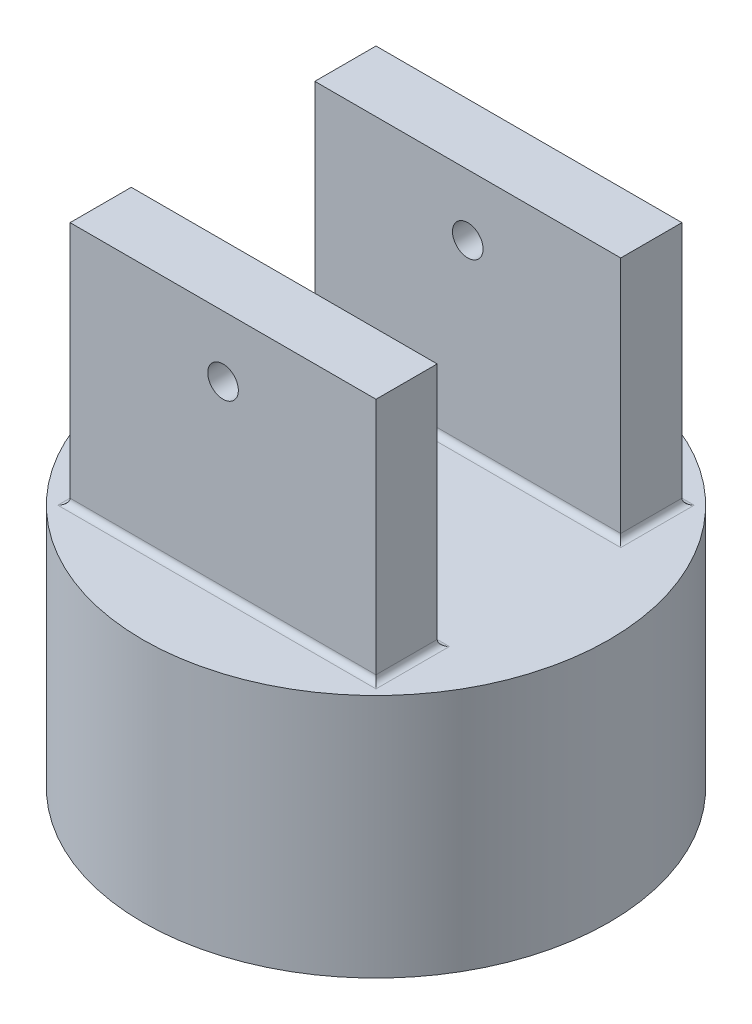
ISO-10303-21;
HEADER;
FILE_DESCRIPTION(('STEP AP214'),'2;1');
FILE_NAME('part.step','',(''),(''),'','','');
FILE_SCHEMA(('AUTOMOTIVE_DESIGN { 1 0 10303 214 1 1 1 1 }'));
ENDSEC;
DATA;
#1=APPLICATION_CONTEXT('core data for automotive mechanical design processes');
#2=APPLICATION_PROTOCOL_DEFINITION('international standard','automotive_design',2000,#1);
#3=PRODUCT_CONTEXT('',#1,'mechanical');
#4=PRODUCT('Part','Part','',(#3));
#5=PRODUCT_RELATED_PRODUCT_CATEGORY('part','',(#4));
#6=PRODUCT_DEFINITION_FORMATION('','',#4);
#7=PRODUCT_DEFINITION_CONTEXT('part definition',#1,'design');
#8=PRODUCT_DEFINITION('design','',#6,#7);
#9=PRODUCT_DEFINITION_SHAPE('','',#8);
#10=(LENGTH_UNIT() NAMED_UNIT(*) SI_UNIT(.MILLI.,.METRE.));
#11=(NAMED_UNIT(*) PLANE_ANGLE_UNIT() SI_UNIT($,.RADIAN.));
#12=(NAMED_UNIT(*) SI_UNIT($,.STERADIAN.) SOLID_ANGLE_UNIT());
#13=UNCERTAINTY_MEASURE_WITH_UNIT(LENGTH_MEASURE(1.E-05),#10,'distance_accuracy_value','');
#14=(GEOMETRIC_REPRESENTATION_CONTEXT(3) GLOBAL_UNCERTAINTY_ASSIGNED_CONTEXT((#13)) GLOBAL_UNIT_ASSIGNED_CONTEXT((#10,
#11,#12)) REPRESENTATION_CONTEXT('',''));
#15=CARTESIAN_POINT('',(0.,0.,0.));
#16=DIRECTION('',(0.,0.,1.));
#17=DIRECTION('',(1.,0.,0.));
#18=AXIS2_PLACEMENT_3D('',#15,#16,#17);
#19=CARTESIAN_POINT('',(25.,0.,0.));
#20=DIRECTION('',(1.,0.,0.));
#21=DIRECTION('',(0.,0.,-1.));
#22=AXIS2_PLACEMENT_3D('',#19,#20,#21);
#23=PLANE('',#22);
#24=DIRECTION('',(0.,1.,0.));
#25=VECTOR('',#24,1.);
#26=CARTESIAN_POINT('',(25.,0.,-7.5));
#27=LINE('',#26,#25);
#28=CARTESIAN_POINT('',(25.,0.5,-7.5));
#29=VERTEX_POINT('',#28);
#30=CARTESIAN_POINT('',(25.,20.,-7.5));
#31=VERTEX_POINT('',#30);
#32=EDGE_CURVE('E153',#29,#31,#27,.T.);
#33=ORIENTED_EDGE('',*,*,#32,.F.);
#34=DIRECTION('',(0.,0.,1.));
#35=VECTOR('',#34,1.);
#36=CARTESIAN_POINT('',(25.,0.5,-12.5));
#37=LINE('',#36,#35);
#38=CARTESIAN_POINT('',(25.,0.5,-12.5));
#39=VERTEX_POINT('',#38);
#40=EDGE_CURVE('E216',#29,#39,#37,.F.);
#41=ORIENTED_EDGE('',*,*,#40,.T.);
#42=DIRECTION('',(0.,1.,0.));
#43=VECTOR('',#42,1.);
#44=CARTESIAN_POINT('',(25.,20.,-12.5));
#45=LINE('',#44,#43);
#46=CARTESIAN_POINT('',(25.,20.,-12.5));
#47=VERTEX_POINT('',#46);
#48=EDGE_CURVE('E168',#39,#47,#45,.T.);
#49=ORIENTED_EDGE('',*,*,#48,.T.);
#50=DIRECTION('',(0.,0.,1.));
#51=VECTOR('',#50,1.);
#52=CARTESIAN_POINT('',(25.,20.,12.5));
#53=LINE('',#52,#51);
#54=EDGE_CURVE('E172',#47,#31,#53,.T.);
#55=ORIENTED_EDGE('',*,*,#54,.T.);
#56=EDGE_LOOP('',(#33,#41,#49,#55));
#57=FACE_BOUND('',#56,.T.);
#58=ADVANCED_FACE('F17',(#57),#23,.T.);
#59=CARTESIAN_POINT('',(0.,0.,0.));
#60=DIRECTION('',(1.,0.,0.));
#61=DIRECTION('',(0.,0.,-1.));
#62=AXIS2_PLACEMENT_3D('',#59,#60,#61);
#63=PLANE('',#62);
#64=DIRECTION('',(0.,1.,0.));
#65=VECTOR('',#64,1.);
#66=CARTESIAN_POINT('',(0.,20.,-12.5));
#67=LINE('',#66,#65);
#68=CARTESIAN_POINT('',(0.,0.5,-12.5));
#69=VERTEX_POINT('',#68);
#70=CARTESIAN_POINT('',(0.,20.,-12.5));
#71=VERTEX_POINT('',#70);
#72=EDGE_CURVE('E167',#69,#71,#67,.T.);
#73=ORIENTED_EDGE('',*,*,#72,.F.);
#74=DIRECTION('',(0.,0.,1.));
#75=VECTOR('',#74,1.);
#76=CARTESIAN_POINT('',(0.,0.5,0.));
#77=LINE('',#76,#75);
#78=CARTESIAN_POINT('',(0.,0.5,-7.5));
#79=VERTEX_POINT('',#78);
#80=EDGE_CURVE('E212',#69,#79,#77,.T.);
#81=ORIENTED_EDGE('',*,*,#80,.T.);
#82=DIRECTION('',(0.,1.,0.));
#83=VECTOR('',#82,1.);
#84=CARTESIAN_POINT('',(0.,0.,-7.5));
#85=LINE('',#84,#83);
#86=CARTESIAN_POINT('',(0.,20.,-7.5));
#87=VERTEX_POINT('',#86);
#88=EDGE_CURVE('E152',#79,#87,#85,.T.);
#89=ORIENTED_EDGE('',*,*,#88,.T.);
#90=DIRECTION('',(0.,0.,1.));
#91=VECTOR('',#90,1.);
#92=CARTESIAN_POINT('',(0.,20.,12.5));
#93=LINE('',#92,#91);
#94=EDGE_CURVE('E180',#71,#87,#93,.T.);
#95=ORIENTED_EDGE('',*,*,#94,.F.);
#96=EDGE_LOOP('',(#73,#81,#89,#95));
#97=FACE_BOUND('',#96,.T.);
#98=ADVANCED_FACE('F279',(#97),#63,.F.);
#99=CARTESIAN_POINT('',(25.,20.,12.5));
#100=DIRECTION('',(0.,-1.,0.));
#101=DIRECTION('',(0.,0.,-1.));
#102=AXIS2_PLACEMENT_3D('',#99,#100,#101);
#103=PLANE('',#102);
#104=DIRECTION('',(-1.,0.,0.));
#105=VECTOR('',#104,1.);
#106=CARTESIAN_POINT('',(25.,20.,-7.5));
#107=LINE('',#106,#105);
#108=EDGE_CURVE('E164',#31,#87,#107,.T.);
#109=ORIENTED_EDGE('',*,*,#108,.F.);
#110=ORIENTED_EDGE('',*,*,#54,.F.);
#111=DIRECTION('',(-1.,0.,0.));
#112=VECTOR('',#111,1.);
#113=CARTESIAN_POINT('',(25.,20.,-12.5));
#114=LINE('',#113,#112);
#115=EDGE_CURVE('E186',#47,#71,#114,.T.);
#116=ORIENTED_EDGE('',*,*,#115,.T.);
#117=ORIENTED_EDGE('',*,*,#94,.T.);
#118=EDGE_LOOP('',(#109,#110,#116,#117));
#119=FACE_BOUND('',#118,.T.);
#120=ADVANCED_FACE('F280',(#119),#103,.F.);
#121=DIRECTION('',(-1.,0.,0.));
#122=VECTOR('',#121,1.);
#123=CARTESIAN_POINT('',(25.,20.,7.5));
#124=LINE('',#123,#122);
#125=CARTESIAN_POINT('',(25.,20.,7.5));
#126=VERTEX_POINT('',#125);
#127=CARTESIAN_POINT('',(0.,20.,7.5));
#128=VERTEX_POINT('',#127);
#129=EDGE_CURVE('E158',#126,#128,#124,.T.);
#130=ORIENTED_EDGE('',*,*,#129,.T.);
#131=CARTESIAN_POINT('',(0.,20.,12.5));
#132=VERTEX_POINT('',#131);
#133=EDGE_CURVE('E179',#128,#132,#93,.T.);
#134=ORIENTED_EDGE('',*,*,#133,.T.);
#135=DIRECTION('',(-1.,0.,0.));
#136=VECTOR('',#135,1.);
#137=CARTESIAN_POINT('',(25.,20.,12.5));
#138=LINE('',#137,#136);
#139=CARTESIAN_POINT('',(25.,20.,12.5));
#140=VERTEX_POINT('',#139);
#141=EDGE_CURVE('E177',#140,#132,#138,.T.);
#142=ORIENTED_EDGE('',*,*,#141,.F.);
#143=EDGE_CURVE('E170',#126,#140,#53,.T.);
#144=ORIENTED_EDGE('',*,*,#143,.F.);
#145=EDGE_LOOP('',(#130,#134,#142,#144));
#146=FACE_BOUND('',#145,.T.);
#147=ADVANCED_FACE('F265',(#146),#103,.F.);
#148=DIRECTION('',(0.,-1.,0.));
#149=VECTOR('',#148,1.);
#150=CARTESIAN_POINT('',(25.,20.,12.5));
#151=LINE('',#150,#149);
#152=CARTESIAN_POINT('',(25.,0.5,12.5));
#153=VERTEX_POINT('',#152);
#154=EDGE_CURVE('E175',#140,#153,#151,.T.);
#155=ORIENTED_EDGE('',*,*,#154,.T.);
#156=DIRECTION('',(0.,0.,1.));
#157=VECTOR('',#156,1.);
#158=CARTESIAN_POINT('',(25.,0.5,7.5));
#159=LINE('',#158,#157);
#160=CARTESIAN_POINT('',(25.,0.5,7.5));
#161=VERTEX_POINT('',#160);
#162=EDGE_CURVE('E39',#153,#161,#159,.F.);
#163=ORIENTED_EDGE('',*,*,#162,.T.);
#164=DIRECTION('',(0.,-1.,0.));
#165=VECTOR('',#164,1.);
#166=CARTESIAN_POINT('',(25.,0.,7.5));
#167=LINE('',#166,#165);
#168=EDGE_CURVE('E155',#126,#161,#167,.T.);
#169=ORIENTED_EDGE('',*,*,#168,.F.);
#170=ORIENTED_EDGE('',*,*,#143,.T.);
#171=EDGE_LOOP('',(#155,#163,#169,#170));
#172=FACE_BOUND('',#171,.T.);
#173=ADVANCED_FACE('F268',(#172),#23,.T.);
#174=DIRECTION('',(0.,-1.,0.));
#175=VECTOR('',#174,1.);
#176=CARTESIAN_POINT('',(0.,0.,7.5));
#177=LINE('',#176,#175);
#178=CARTESIAN_POINT('',(0.,0.5,7.5));
#179=VERTEX_POINT('',#178);
#180=EDGE_CURVE('E156',#128,#179,#177,.T.);
#181=ORIENTED_EDGE('',*,*,#180,.T.);
#182=DIRECTION('',(0.,0.,1.));
#183=VECTOR('',#182,1.);
#184=CARTESIAN_POINT('',(0.,0.5,0.));
#185=LINE('',#184,#183);
#186=CARTESIAN_POINT('',(0.,0.5,12.5));
#187=VERTEX_POINT('',#186);
#188=EDGE_CURVE('E218',#179,#187,#185,.T.);
#189=ORIENTED_EDGE('',*,*,#188,.T.);
#190=DIRECTION('',(0.,-1.,0.));
#191=VECTOR('',#190,1.);
#192=CARTESIAN_POINT('',(0.,20.,12.5));
#193=LINE('',#192,#191);
#194=EDGE_CURVE('E171',#132,#187,#193,.T.);
#195=ORIENTED_EDGE('',*,*,#194,.F.);
#196=ORIENTED_EDGE('',*,*,#133,.F.);
#197=EDGE_LOOP('',(#181,#189,#195,#196));
#198=FACE_BOUND('',#197,.T.);
#199=ADVANCED_FACE('F259',(#198),#63,.F.);
#200=CARTESIAN_POINT('',(25.,20.,-12.5));
#201=DIRECTION('',(0.,0.,1.));
#202=DIRECTION('',(0.,-1.,0.));
#203=AXIS2_PLACEMENT_3D('',#200,#201,#202);
#204=PLANE('',#203);
#205=CARTESIAN_POINT('',(12.5,15.,-12.5));
#206=DIRECTION('',(0.,0.,1.));
#207=DIRECTION('',(1.,0.,0.));
#208=AXIS2_PLACEMENT_3D('',#205,#206,#207);
#209=CIRCLE('',#208,1.25);
#210=CARTESIAN_POINT('',(13.75,15.,-12.5));
#211=VERTEX_POINT('',#210);
#212=EDGE_CURVE('E145',#211,#211,#209,.T.);
#213=ORIENTED_EDGE('',*,*,#212,.T.);
#214=EDGE_LOOP('',(#213));
#215=FACE_BOUND('',#214,.T.);
#216=ORIENTED_EDGE('',*,*,#48,.F.);
#217=DIRECTION('',(-1.,0.,0.));
#218=VECTOR('',#217,1.);
#219=CARTESIAN_POINT('',(25.,0.5,-12.5));
#220=LINE('',#219,#218);
#221=EDGE_CURVE('E189',#39,#69,#220,.T.);
#222=ORIENTED_EDGE('',*,*,#221,.T.);
#223=ORIENTED_EDGE('',*,*,#72,.T.);
#224=ORIENTED_EDGE('',*,*,#115,.F.);
#225=EDGE_LOOP('',(#216,#222,#223,#224));
#226=FACE_BOUND('',#225,.T.);
#227=ADVANCED_FACE('F277',(#215,#226),#204,.F.);
#228=CARTESIAN_POINT('',(25.,20.,12.5));
#229=DIRECTION('',(0.,0.,-1.));
#230=DIRECTION('',(0.,1.,0.));
#231=AXIS2_PLACEMENT_3D('',#228,#229,#230);
#232=PLANE('',#231);
#233=CARTESIAN_POINT('',(12.5,15.,12.5));
#234=DIRECTION('',(0.,0.,1.));
#235=DIRECTION('',(1.,0.,0.));
#236=AXIS2_PLACEMENT_3D('',#233,#234,#235);
#237=CIRCLE('',#236,1.24999999999999);
#238=CARTESIAN_POINT('',(13.75,15.,12.5));
#239=VERTEX_POINT('',#238);
#240=EDGE_CURVE('E142',#239,#239,#237,.T.);
#241=ORIENTED_EDGE('',*,*,#240,.F.);
#242=EDGE_LOOP('',(#241));
#243=FACE_BOUND('',#242,.T.);
#244=ORIENTED_EDGE('',*,*,#194,.T.);
#245=DIRECTION('',(1.,0.,0.));
#246=VECTOR('',#245,1.);
#247=CARTESIAN_POINT('',(25.,0.5,12.5));
#248=LINE('',#247,#246);
#249=EDGE_CURVE('E11',#187,#153,#248,.T.);
#250=ORIENTED_EDGE('',*,*,#249,.T.);
#251=ORIENTED_EDGE('',*,*,#154,.F.);
#252=ORIENTED_EDGE('',*,*,#141,.T.);
#253=EDGE_LOOP('',(#244,#250,#251,#252));
#254=FACE_BOUND('',#253,.T.);
#255=ADVANCED_FACE('F261',(#243,#254),#232,.F.);
#256=CARTESIAN_POINT('',(25.,0.,-7.5));
#257=DIRECTION('',(0.,0.,1.));
#258=DIRECTION('',(1.,0.,0.));
#259=AXIS2_PLACEMENT_3D('',#256,#257,#258);
#260=PLANE('',#259);
#261=CARTESIAN_POINT('',(12.5,15.,-7.5));
#262=DIRECTION('',(0.,0.,1.));
#263=DIRECTION('',(1.,0.,0.));
#264=AXIS2_PLACEMENT_3D('',#261,#262,#263);
#265=CIRCLE('',#264,1.25);
#266=CARTESIAN_POINT('',(13.75,15.,-7.5));
#267=VERTEX_POINT('',#266);
#268=EDGE_CURVE('E149',#267,#267,#265,.T.);
#269=ORIENTED_EDGE('',*,*,#268,.F.);
#270=EDGE_LOOP('',(#269));
#271=FACE_BOUND('',#270,.T.);
#272=ORIENTED_EDGE('',*,*,#88,.F.);
#273=DIRECTION('',(-1.,0.,0.));
#274=VECTOR('',#273,1.);
#275=CARTESIAN_POINT('',(25.,0.5,-7.5));
#276=LINE('',#275,#274);
#277=EDGE_CURVE('E214',#79,#29,#276,.F.);
#278=ORIENTED_EDGE('',*,*,#277,.T.);
#279=ORIENTED_EDGE('',*,*,#32,.T.);
#280=ORIENTED_EDGE('',*,*,#108,.T.);
#281=EDGE_LOOP('',(#272,#278,#279,#280));
#282=FACE_BOUND('',#281,.T.);
#283=ADVANCED_FACE('F318',(#271,#282),#260,.T.);
#284=CARTESIAN_POINT('',(25.,0.,7.5));
#285=DIRECTION('',(0.,0.,-1.));
#286=DIRECTION('',(-1.,0.,0.));
#287=AXIS2_PLACEMENT_3D('',#284,#285,#286);
#288=PLANE('',#287);
#289=CARTESIAN_POINT('',(12.5,15.,7.5));
#290=DIRECTION('',(0.,0.,-1.));
#291=DIRECTION('',(-1.,0.,0.));
#292=AXIS2_PLACEMENT_3D('',#289,#290,#291);
#293=CIRCLE('',#292,1.25);
#294=CARTESIAN_POINT('',(11.25,15.,7.5));
#295=VERTEX_POINT('',#294);
#296=EDGE_CURVE('E148',#295,#295,#293,.T.);
#297=ORIENTED_EDGE('',*,*,#296,.F.);
#298=EDGE_LOOP('',(#297));
#299=FACE_BOUND('',#298,.T.);
#300=ORIENTED_EDGE('',*,*,#168,.T.);
#301=DIRECTION('',(-1.,0.,0.));
#302=VECTOR('',#301,1.);
#303=CARTESIAN_POINT('',(0.,0.5,7.5));
#304=LINE('',#303,#302);
#305=EDGE_CURVE('E26',#161,#179,#304,.T.);
#306=ORIENTED_EDGE('',*,*,#305,.T.);
#307=ORIENTED_EDGE('',*,*,#180,.F.);
#308=ORIENTED_EDGE('',*,*,#129,.F.);
#309=EDGE_LOOP('',(#300,#306,#307,#308));
#310=FACE_BOUND('',#309,.T.);
#311=ADVANCED_FACE('F267',(#299,#310),#288,.T.);
#312=CARTESIAN_POINT('',(25.,0.,7.5));
#313=DIRECTION('',(0.,1.,0.));
#314=DIRECTION('',(0.,0.,1.));
#315=AXIS2_PLACEMENT_3D('',#312,#313,#314);
#316=PLANE('',#315);
#317=DIRECTION('',(0.,0.,1.));
#318=VECTOR('',#317,1.);
#319=CARTESIAN_POINT('',(-0.5,0.,7.5));
#320=LINE('',#319,#318);
#321=CARTESIAN_POINT('',(-0.5,0.,-7.));
#322=VERTEX_POINT('',#321);
#323=CARTESIAN_POINT('',(-0.5,0.,-13.));
#324=VERTEX_POINT('',#323);
#325=EDGE_CURVE('E207',#322,#324,#320,.F.);
#326=ORIENTED_EDGE('',*,*,#325,.T.);
#327=DIRECTION('',(-1.,0.,0.));
#328=VECTOR('',#327,1.);
#329=CARTESIAN_POINT('',(25.,0.,-13.));
#330=LINE('',#329,#328);
#331=CARTESIAN_POINT('',(25.5,0.,-13.));
#332=VERTEX_POINT('',#331);
#333=EDGE_CURVE('E209',#324,#332,#330,.F.);
#334=ORIENTED_EDGE('',*,*,#333,.T.);
#335=DIRECTION('',(0.,0.,1.));
#336=VECTOR('',#335,1.);
#337=CARTESIAN_POINT('',(25.5,0.,-7.5));
#338=LINE('',#337,#336);
#339=CARTESIAN_POINT('',(25.5,0.,-7.));
#340=VERTEX_POINT('',#339);
#341=EDGE_CURVE('E203',#332,#340,#338,.T.);
#342=ORIENTED_EDGE('',*,*,#341,.T.);
#343=DIRECTION('',(-1.,0.,0.));
#344=VECTOR('',#343,1.);
#345=CARTESIAN_POINT('',(0.,0.,-7.));
#346=LINE('',#345,#344);
#347=EDGE_CURVE('E205',#340,#322,#346,.T.);
#348=ORIENTED_EDGE('',*,*,#347,.T.);
#349=EDGE_LOOP('',(#326,#334,#342,#348));
#350=FACE_BOUND('',#349,.T.);
#351=DIRECTION('',(0.,0.,1.));
#352=VECTOR('',#351,1.);
#353=CARTESIAN_POINT('',(-0.5,0.,7.5));
#354=LINE('',#353,#352);
#355=CARTESIAN_POINT('',(-0.5,0.,13.));
#356=VERTEX_POINT('',#355);
#357=CARTESIAN_POINT('',(-0.5,0.,7.));
#358=VERTEX_POINT('',#357);
#359=EDGE_CURVE('E198',#356,#358,#354,.F.);
#360=ORIENTED_EDGE('',*,*,#359,.T.);
#361=DIRECTION('',(-1.,0.,0.));
#362=VECTOR('',#361,1.);
#363=CARTESIAN_POINT('',(25.,0.,7.));
#364=LINE('',#363,#362);
#365=CARTESIAN_POINT('',(25.5,0.,7.));
#366=VERTEX_POINT('',#365);
#367=EDGE_CURVE('E201',#358,#366,#364,.F.);
#368=ORIENTED_EDGE('',*,*,#367,.T.);
#369=DIRECTION('',(0.,0.,1.));
#370=VECTOR('',#369,1.);
#371=CARTESIAN_POINT('',(25.5,0.,12.5));
#372=LINE('',#371,#370);
#373=CARTESIAN_POINT('',(25.5,0.,13.));
#374=VERTEX_POINT('',#373);
#375=EDGE_CURVE('E196',#366,#374,#372,.T.);
#376=ORIENTED_EDGE('',*,*,#375,.T.);
#377=DIRECTION('',(1.,0.,0.));
#378=VECTOR('',#377,1.);
#379=CARTESIAN_POINT('',(25.,0.,13.));
#380=LINE('',#379,#378);
#381=EDGE_CURVE('E194',#374,#356,#380,.F.);
#382=ORIENTED_EDGE('',*,*,#381,.T.);
#383=EDGE_LOOP('',(#360,#368,#376,#382));
#384=FACE_BOUND('',#383,.T.);
#385=CARTESIAN_POINT('',(12.5,0.,0.));
#386=DIRECTION('',(0.,1.,0.));
#387=DIRECTION('',(0.,0.,1.));
#388=AXIS2_PLACEMENT_3D('',#385,#386,#387);
#389=CIRCLE('',#388,19.05);
#390=CARTESIAN_POINT('',(12.5,0.,19.05));
#391=VERTEX_POINT('',#390);
#392=EDGE_CURVE('E138',#391,#391,#389,.F.);
#393=ORIENTED_EDGE('',*,*,#392,.F.);
#394=EDGE_LOOP('',(#393));
#395=FACE_BOUND('',#394,.T.);
#396=ADVANCED_FACE('F249',(#350,#384,#395),#316,.T.);
#397=CARTESIAN_POINT('',(12.5,15.,12.5));
#398=DIRECTION('',(0.,0.,1.));
#399=DIRECTION('',(1.,0.,0.));
#400=AXIS2_PLACEMENT_3D('',#397,#398,#399);
#401=CYLINDRICAL_SURFACE('',#400,1.25);
#402=ORIENTED_EDGE('',*,*,#296,.T.);
#403=EDGE_LOOP('',(#402));
#404=FACE_BOUND('',#403,.T.);
#405=ORIENTED_EDGE('',*,*,#240,.T.);
#406=EDGE_LOOP('',(#405));
#407=FACE_BOUND('',#406,.T.);
#408=ADVANCED_FACE('F334',(#404,#407),#401,.F.);
#409=ORIENTED_EDGE('',*,*,#268,.T.);
#410=EDGE_LOOP('',(#409));
#411=FACE_BOUND('',#410,.T.);
#412=ORIENTED_EDGE('',*,*,#212,.F.);
#413=EDGE_LOOP('',(#412));
#414=FACE_BOUND('',#413,.T.);
#415=ADVANCED_FACE('F338',(#411,#414),#401,.F.);
#416=CARTESIAN_POINT('',(12.5,53.8815367264149,0.));
#417=DIRECTION('',(0.,-1.,0.));
#418=DIRECTION('',(0.,0.,-1.));
#419=AXIS2_PLACEMENT_3D('',#416,#417,#418);
#420=CYLINDRICAL_SURFACE('',#419,19.05);
#421=CARTESIAN_POINT('',(12.5,-20.,0.));
#422=DIRECTION('',(0.,-1.,0.));
#423=DIRECTION('',(0.,0.,-1.));
#424=AXIS2_PLACEMENT_3D('',#421,#422,#423);
#425=CIRCLE('',#424,19.05);
#426=CARTESIAN_POINT('',(12.5,-20.,-19.05));
#427=VERTEX_POINT('',#426);
#428=EDGE_CURVE('E135',#427,#427,#425,.T.);
#429=ORIENTED_EDGE('',*,*,#428,.F.);
#430=EDGE_LOOP('',(#429));
#431=FACE_BOUND('',#430,.T.);
#432=ORIENTED_EDGE('',*,*,#392,.T.);
#433=EDGE_LOOP('',(#432));
#434=FACE_BOUND('',#433,.T.);
#435=ADVANCED_FACE('F340',(#431,#434),#420,.T.);
#436=CARTESIAN_POINT('',(25.,-20.,12.5));
#437=DIRECTION('',(0.,1.,0.));
#438=DIRECTION('',(0.,0.,1.));
#439=AXIS2_PLACEMENT_3D('',#436,#437,#438);
#440=PLANE('',#439);
#441=CARTESIAN_POINT('',(20.,-20.,0.));
#442=DIRECTION('',(0.,-1.,0.));
#443=DIRECTION('',(0.,0.,-1.));
#444=AXIS2_PLACEMENT_3D('',#441,#442,#443);
#445=CIRCLE('',#444,1.25);
#446=CARTESIAN_POINT('',(20.,-20.,-1.25));
#447=VERTEX_POINT('',#446);
#448=EDGE_CURVE('E124',#447,#447,#445,.T.);
#449=ORIENTED_EDGE('',*,*,#448,.F.);
#450=EDGE_LOOP('',(#449));
#451=FACE_BOUND('',#450,.T.);
#452=CARTESIAN_POINT('',(5.,-20.,0.));
#453=DIRECTION('',(0.,-1.,0.));
#454=DIRECTION('',(0.,0.,-1.));
#455=AXIS2_PLACEMENT_3D('',#452,#453,#454);
#456=CIRCLE('',#455,1.25);
#457=CARTESIAN_POINT('',(5.,-20.,-1.25));
#458=VERTEX_POINT('',#457);
#459=EDGE_CURVE('E123',#458,#458,#456,.T.);
#460=ORIENTED_EDGE('',*,*,#459,.F.);
#461=EDGE_LOOP('',(#460));
#462=FACE_BOUND('',#461,.T.);
#463=ORIENTED_EDGE('',*,*,#428,.T.);
#464=EDGE_LOOP('',(#463));
#465=FACE_BOUND('',#464,.T.);
#466=ADVANCED_FACE('F343',(#451,#462,#465),#440,.F.);
#467=CARTESIAN_POINT('',(25.,0.5,-7.));
#468=DIRECTION('',(1.,0.,0.));
#469=DIRECTION('',(0.,0.,-1.));
#470=AXIS2_PLACEMENT_3D('',#467,#468,#469);
#471=CYLINDRICAL_SURFACE('',#470,0.5);
#472=CARTESIAN_POINT('',(-0.5,0.5,-7.));
#473=DIRECTION('',(0.707106781186548,0.,0.707106781186548));
#474=DIRECTION('',(0.707106781186548,0.,-0.707106781186548));
#475=AXIS2_PLACEMENT_3D('',#472,#473,#474);
#476=ELLIPSE('',#475,0.707106781186548,0.5);
#477=EDGE_CURVE('E227',#322,#79,#476,.T.);
#478=ORIENTED_EDGE('',*,*,#477,.F.);
#479=ORIENTED_EDGE('',*,*,#347,.F.);
#480=CARTESIAN_POINT('',(25.5,0.5,-7.));
#481=DIRECTION('',(0.707106781186548,0.,-0.707106781186548));
#482=DIRECTION('',(-0.707106781186548,0.,-0.707106781186548));
#483=AXIS2_PLACEMENT_3D('',#480,#481,#482);
#484=ELLIPSE('',#483,0.707106781186548,0.5);
#485=EDGE_CURVE('E139',#29,#340,#484,.F.);
#486=ORIENTED_EDGE('',*,*,#485,.F.);
#487=ORIENTED_EDGE('',*,*,#277,.F.);
#488=EDGE_LOOP('',(#478,#479,#486,#487));
#489=FACE_BOUND('',#488,.T.);
#490=ADVANCED_FACE('F301',(#489),#471,.F.);
#491=CARTESIAN_POINT('',(25.5,0.5,7.5));
#492=DIRECTION('',(0.,0.,-1.));
#493=DIRECTION('',(-1.,0.,0.));
#494=AXIS2_PLACEMENT_3D('',#491,#492,#493);
#495=CYLINDRICAL_SURFACE('',#494,0.5);
#496=ORIENTED_EDGE('',*,*,#485,.T.);
#497=ORIENTED_EDGE('',*,*,#341,.F.);
#498=CARTESIAN_POINT('',(25.5,0.5,-13.));
#499=DIRECTION('',(-0.707106781186548,0.,-0.707106781186548));
#500=DIRECTION('',(0.707106781186548,0.,-0.707106781186548));
#501=AXIS2_PLACEMENT_3D('',#498,#499,#500);
#502=ELLIPSE('',#501,0.707106781186548,0.5);
#503=EDGE_CURVE('E225',#39,#332,#502,.F.);
#504=ORIENTED_EDGE('',*,*,#503,.F.);
#505=ORIENTED_EDGE('',*,*,#40,.F.);
#506=EDGE_LOOP('',(#496,#497,#504,#505));
#507=FACE_BOUND('',#506,.T.);
#508=ADVANCED_FACE('F305',(#507),#495,.F.);
#509=CARTESIAN_POINT('',(-0.5,0.5,0.));
#510=DIRECTION('',(0.,0.,1.));
#511=DIRECTION('',(1.,0.,0.));
#512=AXIS2_PLACEMENT_3D('',#509,#510,#511);
#513=CYLINDRICAL_SURFACE('',#512,0.5);
#514=ORIENTED_EDGE('',*,*,#477,.T.);
#515=ORIENTED_EDGE('',*,*,#80,.F.);
#516=CARTESIAN_POINT('',(-0.5,0.5,-13.));
#517=DIRECTION('',(-0.707106781186548,0.,0.707106781186548));
#518=DIRECTION('',(0.707106781186548,0.,0.707106781186548));
#519=AXIS2_PLACEMENT_3D('',#516,#517,#518);
#520=ELLIPSE('',#519,0.707106781186548,0.5);
#521=EDGE_CURVE('E223',#324,#69,#520,.T.);
#522=ORIENTED_EDGE('',*,*,#521,.F.);
#523=ORIENTED_EDGE('',*,*,#325,.F.);
#524=EDGE_LOOP('',(#514,#515,#522,#523));
#525=FACE_BOUND('',#524,.T.);
#526=ADVANCED_FACE('F380',(#525),#513,.F.);
#527=CARTESIAN_POINT('',(25.,0.5,-13.));
#528=DIRECTION('',(-1.,0.,0.));
#529=DIRECTION('',(0.,0.,1.));
#530=AXIS2_PLACEMENT_3D('',#527,#528,#529);
#531=CYLINDRICAL_SURFACE('',#530,0.5);
#532=ORIENTED_EDGE('',*,*,#503,.T.);
#533=ORIENTED_EDGE('',*,*,#333,.F.);
#534=ORIENTED_EDGE('',*,*,#521,.T.);
#535=ORIENTED_EDGE('',*,*,#221,.F.);
#536=EDGE_LOOP('',(#532,#533,#534,#535));
#537=FACE_BOUND('',#536,.T.);
#538=ADVANCED_FACE('F309',(#537),#531,.F.);
#539=CARTESIAN_POINT('',(25.5,0.5,7.5));
#540=DIRECTION('',(0.,0.,-1.));
#541=DIRECTION('',(-1.,0.,0.));
#542=AXIS2_PLACEMENT_3D('',#539,#540,#541);
#543=CYLINDRICAL_SURFACE('',#542,0.5);
#544=CARTESIAN_POINT('',(25.5,0.5,13.));
#545=DIRECTION('',(0.707106781186548,0.,-0.707106781186548));
#546=DIRECTION('',(0.707106781186548,0.,0.707106781186548));
#547=AXIS2_PLACEMENT_3D('',#544,#545,#546);
#548=ELLIPSE('',#547,0.707106781186548,0.5);
#549=EDGE_CURVE('E234',#374,#153,#548,.T.);
#550=ORIENTED_EDGE('',*,*,#549,.F.);
#551=ORIENTED_EDGE('',*,*,#375,.F.);
#552=CARTESIAN_POINT('',(25.5,0.5,7.));
#553=DIRECTION('',(0.707106781186548,0.,0.707106781186548));
#554=DIRECTION('',(0.707106781186548,0.,-0.707106781186548));
#555=AXIS2_PLACEMENT_3D('',#552,#553,#554);
#556=ELLIPSE('',#555,0.707106781186548,0.5);
#557=EDGE_CURVE('E21',#161,#366,#556,.T.);
#558=ORIENTED_EDGE('',*,*,#557,.F.);
#559=ORIENTED_EDGE('',*,*,#162,.F.);
#560=EDGE_LOOP('',(#550,#551,#558,#559));
#561=FACE_BOUND('',#560,.T.);
#562=ADVANCED_FACE('F19',(#561),#543,.F.);
#563=CARTESIAN_POINT('',(25.,0.5,7.));
#564=DIRECTION('',(1.,0.,0.));
#565=DIRECTION('',(0.,0.,-1.));
#566=AXIS2_PLACEMENT_3D('',#563,#564,#565);
#567=CYLINDRICAL_SURFACE('',#566,0.5);
#568=ORIENTED_EDGE('',*,*,#557,.T.);
#569=ORIENTED_EDGE('',*,*,#367,.F.);
#570=CARTESIAN_POINT('',(-0.5,0.5,7.));
#571=DIRECTION('',(0.707106781186548,0.,-0.707106781186548));
#572=DIRECTION('',(0.707106781186548,0.,0.707106781186548));
#573=AXIS2_PLACEMENT_3D('',#570,#571,#572);
#574=ELLIPSE('',#573,0.707106781186548,0.5);
#575=EDGE_CURVE('E233',#179,#358,#574,.T.);
#576=ORIENTED_EDGE('',*,*,#575,.F.);
#577=ORIENTED_EDGE('',*,*,#305,.F.);
#578=EDGE_LOOP('',(#568,#569,#576,#577));
#579=FACE_BOUND('',#578,.T.);
#580=ADVANCED_FACE('F244',(#579),#567,.F.);
#581=CARTESIAN_POINT('',(25.,0.5,13.));
#582=DIRECTION('',(1.,0.,0.));
#583=DIRECTION('',(0.,0.,-1.));
#584=AXIS2_PLACEMENT_3D('',#581,#582,#583);
#585=CYLINDRICAL_SURFACE('',#584,0.5);
#586=ORIENTED_EDGE('',*,*,#549,.T.);
#587=ORIENTED_EDGE('',*,*,#249,.F.);
#588=CARTESIAN_POINT('',(-0.5,0.5,13.));
#589=DIRECTION('',(0.707106781186548,0.,0.707106781186548));
#590=DIRECTION('',(0.707106781186548,0.,-0.707106781186548));
#591=AXIS2_PLACEMENT_3D('',#588,#589,#590);
#592=ELLIPSE('',#591,0.707106781186548,0.5);
#593=EDGE_CURVE('E134',#356,#187,#592,.T.);
#594=ORIENTED_EDGE('',*,*,#593,.F.);
#595=ORIENTED_EDGE('',*,*,#381,.F.);
#596=EDGE_LOOP('',(#586,#587,#594,#595));
#597=FACE_BOUND('',#596,.T.);
#598=ADVANCED_FACE('F256',(#597),#585,.F.);
#599=CARTESIAN_POINT('',(-0.5,0.5,0.));
#600=DIRECTION('',(0.,0.,1.));
#601=DIRECTION('',(1.,0.,0.));
#602=AXIS2_PLACEMENT_3D('',#599,#600,#601);
#603=CYLINDRICAL_SURFACE('',#602,0.5);
#604=ORIENTED_EDGE('',*,*,#575,.T.);
#605=ORIENTED_EDGE('',*,*,#359,.F.);
#606=ORIENTED_EDGE('',*,*,#593,.T.);
#607=ORIENTED_EDGE('',*,*,#188,.F.);
#608=EDGE_LOOP('',(#604,#605,#606,#607));
#609=FACE_BOUND('',#608,.T.);
#610=ADVANCED_FACE('F254',(#609),#603,.F.);
#611=CARTESIAN_POINT('',(5.,-12.5,0.));
#612=DIRECTION('',(0.,-1.,0.));
#613=DIRECTION('',(0.,0.,-1.));
#614=AXIS2_PLACEMENT_3D('',#611,#612,#613);
#615=CONICAL_SURFACE('',#614,1.24999999999999,1.02974425867664);
#616=CARTESIAN_POINT('',(5.,-11.7489242262155,0.));
#617=VERTEX_POINT('',#616);
#618=VERTEX_LOOP('',#617);
#619=FACE_BOUND('',#618,.T.);
#620=CARTESIAN_POINT('',(5.,-12.5,0.));
#621=DIRECTION('',(0.,-1.,0.));
#622=DIRECTION('',(0.,0.,-1.));
#623=AXIS2_PLACEMENT_3D('',#620,#621,#622);
#624=CIRCLE('',#623,1.24999999999999);
#625=CARTESIAN_POINT('',(5.,-12.5,-1.24999999999998));
#626=VERTEX_POINT('',#625);
#627=EDGE_CURVE('E127',#626,#626,#624,.T.);
#628=ORIENTED_EDGE('',*,*,#627,.T.);
#629=EDGE_LOOP('',(#628));
#630=FACE_BOUND('',#629,.T.);
#631=ADVANCED_FACE('F345',(#619,#630),#615,.F.);
#632=CARTESIAN_POINT('',(5.,-20.,0.));
#633=DIRECTION('',(0.,-1.,0.));
#634=DIRECTION('',(0.,0.,-1.));
#635=AXIS2_PLACEMENT_3D('',#632,#633,#634);
#636=CYLINDRICAL_SURFACE('',#635,1.24999999999999);
#637=ORIENTED_EDGE('',*,*,#627,.F.);
#638=EDGE_LOOP('',(#637));
#639=FACE_BOUND('',#638,.T.);
#640=ORIENTED_EDGE('',*,*,#459,.T.);
#641=EDGE_LOOP('',(#640));
#642=FACE_BOUND('',#641,.T.);
#643=ADVANCED_FACE('F117',(#639,#642),#636,.F.);
#644=CARTESIAN_POINT('',(20.,-12.5,0.));
#645=DIRECTION('',(0.,-1.,0.));
#646=DIRECTION('',(0.,0.,-1.));
#647=AXIS2_PLACEMENT_3D('',#644,#645,#646);
#648=CONICAL_SURFACE('',#647,1.24999999999999,1.02974425867664);
#649=CARTESIAN_POINT('',(20.,-11.7489242262155,0.));
#650=VERTEX_POINT('',#649);
#651=VERTEX_LOOP('',#650);
#652=FACE_BOUND('',#651,.T.);
#653=CARTESIAN_POINT('',(20.,-12.5,0.));
#654=DIRECTION('',(0.,-1.,0.));
#655=DIRECTION('',(0.,0.,-1.));
#656=AXIS2_PLACEMENT_3D('',#653,#654,#655);
#657=CIRCLE('',#656,1.24999999999999);
#658=CARTESIAN_POINT('',(20.,-12.5,-1.24999999999998));
#659=VERTEX_POINT('',#658);
#660=EDGE_CURVE('E121',#659,#659,#657,.T.);
#661=ORIENTED_EDGE('',*,*,#660,.T.);
#662=EDGE_LOOP('',(#661));
#663=FACE_BOUND('',#662,.T.);
#664=ADVANCED_FACE('F113',(#652,#663),#648,.F.);
#665=CARTESIAN_POINT('',(20.,-20.,0.));
#666=DIRECTION('',(0.,-1.,0.));
#667=DIRECTION('',(0.,0.,-1.));
#668=AXIS2_PLACEMENT_3D('',#665,#666,#667);
#669=CYLINDRICAL_SURFACE('',#668,1.25);
#670=ORIENTED_EDGE('',*,*,#660,.F.);
#671=EDGE_LOOP('',(#670));
#672=FACE_BOUND('',#671,.T.);
#673=ORIENTED_EDGE('',*,*,#448,.T.);
#674=EDGE_LOOP('',(#673));
#675=FACE_BOUND('',#674,.T.);
#676=ADVANCED_FACE('F116',(#672,#675),#669,.F.);
#677=CLOSED_SHELL('',(#58,#98,#120,#147,#173,#199,#227,#255,#283,#311,#396,#408,#415,#435,#466,
#490,#508,#526,#538,#562,#580,#598,#610,#631,#643,#664,#676));
#678=MANIFOLD_SOLID_BREP('B1',#677);
#679=ADVANCED_BREP_SHAPE_REPRESENTATION('',(#18,#678),#14);
#680=SHAPE_DEFINITION_REPRESENTATION(#9,#679);
ENDSEC;
END-ISO-10303-21;
